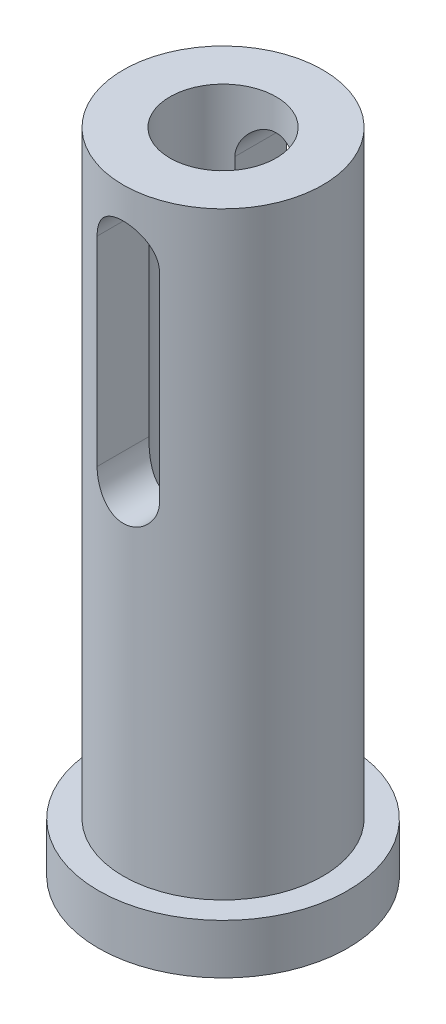
ISO-10303-21;
HEADER;
FILE_DESCRIPTION(('STEP AP214'),'2;1');
FILE_NAME('part.step','',(''),(''),'','','');
FILE_SCHEMA(('AUTOMOTIVE_DESIGN { 1 0 10303 214 1 1 1 1 }'));
ENDSEC;
DATA;
#1=APPLICATION_CONTEXT('core data for automotive mechanical design processes');
#2=APPLICATION_PROTOCOL_DEFINITION('international standard','automotive_design',2000,#1);
#3=PRODUCT_CONTEXT('',#1,'mechanical');
#4=PRODUCT('Part','Part','',(#3));
#5=PRODUCT_RELATED_PRODUCT_CATEGORY('part','',(#4));
#6=PRODUCT_DEFINITION_FORMATION('','',#4);
#7=PRODUCT_DEFINITION_CONTEXT('part definition',#1,'design');
#8=PRODUCT_DEFINITION('design','',#6,#7);
#9=PRODUCT_DEFINITION_SHAPE('','',#8);
#10=(LENGTH_UNIT() NAMED_UNIT(*) SI_UNIT(.MILLI.,.METRE.));
#11=(NAMED_UNIT(*) PLANE_ANGLE_UNIT() SI_UNIT($,.RADIAN.));
#12=(NAMED_UNIT(*) SI_UNIT($,.STERADIAN.) SOLID_ANGLE_UNIT());
#13=UNCERTAINTY_MEASURE_WITH_UNIT(LENGTH_MEASURE(1.E-05),#10,'distance_accuracy_value','');
#14=(GEOMETRIC_REPRESENTATION_CONTEXT(3) GLOBAL_UNCERTAINTY_ASSIGNED_CONTEXT((#13)) GLOBAL_UNIT_ASSIGNED_CONTEXT((#10,
#11,#12)) REPRESENTATION_CONTEXT('',''));
#15=CARTESIAN_POINT('',(0.,0.,0.));
#16=DIRECTION('',(0.,0.,1.));
#17=DIRECTION('',(1.,0.,0.));
#18=AXIS2_PLACEMENT_3D('',#15,#16,#17);
#19=CARTESIAN_POINT('',(0.,1.27,0.));
#20=DIRECTION('',(0.,1.,0.));
#21=DIRECTION('',(0.,0.,1.));
#22=AXIS2_PLACEMENT_3D('',#19,#20,#21);
#23=PLANE('',#22);
#24=CARTESIAN_POINT('',(0.,1.27,0.));
#25=DIRECTION('',(0.,1.,0.));
#26=DIRECTION('',(0.,0.,1.));
#27=AXIS2_PLACEMENT_3D('',#24,#25,#26);
#28=CIRCLE('',#27,3.175);
#29=CARTESIAN_POINT('',(0.,1.27,3.175));
#30=VERTEX_POINT('',#29);
#31=EDGE_CURVE('E111',#30,#30,#28,.T.);
#32=ORIENTED_EDGE('',*,*,#31,.T.);
#33=EDGE_LOOP('',(#32));
#34=FACE_BOUND('',#33,.T.);
#35=CARTESIAN_POINT('',(0.,1.27,0.));
#36=DIRECTION('',(0.,1.,0.));
#37=DIRECTION('',(0.,0.,1.));
#38=AXIS2_PLACEMENT_3D('',#35,#36,#37);
#39=CIRCLE('',#38,2.54);
#40=CARTESIAN_POINT('',(0.,1.27,2.54));
#41=VERTEX_POINT('',#40);
#42=EDGE_CURVE('E238',#41,#41,#39,.T.);
#43=ORIENTED_EDGE('',*,*,#42,.F.);
#44=EDGE_LOOP('',(#43));
#45=FACE_BOUND('',#44,.T.);
#46=ADVANCED_FACE('F34',(#34,#45),#23,.T.);
#47=CARTESIAN_POINT('',(0.,1.27,0.));
#48=DIRECTION('',(0.,-1.,0.));
#49=DIRECTION('',(0.,0.,-1.));
#50=AXIS2_PLACEMENT_3D('',#47,#48,#49);
#51=CYLINDRICAL_SURFACE('',#50,3.175);
#52=ORIENTED_EDGE('',*,*,#31,.F.);
#53=EDGE_LOOP('',(#52));
#54=FACE_BOUND('',#53,.T.);
#55=CARTESIAN_POINT('',(0.,0.,0.));
#56=DIRECTION('',(0.,1.,0.));
#57=DIRECTION('',(0.,0.,1.));
#58=AXIS2_PLACEMENT_3D('',#55,#56,#57);
#59=CIRCLE('',#58,3.175);
#60=CARTESIAN_POINT('',(0.,0.,3.175));
#61=VERTEX_POINT('',#60);
#62=EDGE_CURVE('E244',#61,#61,#59,.T.);
#63=ORIENTED_EDGE('',*,*,#62,.T.);
#64=EDGE_LOOP('',(#63));
#65=FACE_BOUND('',#64,.T.);
#66=ADVANCED_FACE('F36',(#54,#65),#51,.T.);
#67=CARTESIAN_POINT('',(0.,0.,0.));
#68=DIRECTION('',(0.,1.,0.));
#69=DIRECTION('',(0.,0.,1.));
#70=AXIS2_PLACEMENT_3D('',#67,#68,#69);
#71=PLANE('',#70);
#72=CARTESIAN_POINT('',(0.,0.,0.));
#73=DIRECTION('',(0.,1.,0.));
#74=DIRECTION('',(0.,0.,1.));
#75=AXIS2_PLACEMENT_3D('',#72,#73,#74);
#76=CIRCLE('',#75,1.35255);
#77=CARTESIAN_POINT('',(0.,0.,1.35255));
#78=VERTEX_POINT('',#77);
#79=EDGE_CURVE('E234',#78,#78,#76,.T.);
#80=ORIENTED_EDGE('',*,*,#79,.T.);
#81=EDGE_LOOP('',(#80));
#82=FACE_BOUND('',#81,.T.);
#83=ORIENTED_EDGE('',*,*,#62,.F.);
#84=EDGE_LOOP('',(#83));
#85=FACE_BOUND('',#84,.T.);
#86=ADVANCED_FACE('F174',(#82,#85),#71,.F.);
#87=CARTESIAN_POINT('',(0.,16.51,0.));
#88=DIRECTION('',(0.,-1.,0.));
#89=DIRECTION('',(0.,0.,-1.));
#90=AXIS2_PLACEMENT_3D('',#87,#88,#89);
#91=CYLINDRICAL_SURFACE('',#90,2.54);
#92=DIRECTION('',(0.,-1.,0.));
#93=VECTOR('',#92,1.);
#94=CARTESIAN_POINT('',(0.79375,16.51,-2.41279110937934));
#95=LINE('',#94,#93);
#96=CARTESIAN_POINT('',(0.793750000000001,9.8425,-2.41279110937934));
#97=VERTEX_POINT('',#96);
#98=CARTESIAN_POINT('',(0.79375,14.9225,-2.41279110937934));
#99=VERTEX_POINT('',#98);
#100=EDGE_CURVE('E357',#97,#99,#95,.F.);
#101=ORIENTED_EDGE('',*,*,#100,.T.);
#102=CARTESIAN_POINT('',(0.79375,14.9225,-2.41279110937934));
#103=CARTESIAN_POINT('',(0.79379281067982,14.9659894481781,-2.4127435138089));
#104=CARTESIAN_POINT('',(0.790178957825597,15.0094418537647,-2.4139657836181));
#105=CARTESIAN_POINT('',(0.775984671234205,15.0949571729906,-2.418583363011));
#106=CARTESIAN_POINT('',(0.765423455768592,15.1370235845318,-2.42197267724452));
#107=CARTESIAN_POINT('',(0.737683634860841,15.2186870178144,-2.43055955714717));
#108=CARTESIAN_POINT('',(0.720507826274989,15.258285075042,-2.43575635846453));
#109=CARTESIAN_POINT('',(0.680072584019287,15.3340640830475,-2.44735479284788));
#110=CARTESIAN_POINT('',(0.65680998971098,15.3702432451978,-2.45375705137663));
#111=CARTESIAN_POINT('',(0.604010165831729,15.4393761403172,-2.46729294390163));
#112=CARTESIAN_POINT('',(0.574300994184663,15.4721953614169,-2.47444308299022));
#113=CARTESIAN_POINT('',(0.509818467586185,15.5324775419246,-2.48852830450001));
#114=CARTESIAN_POINT('',(0.475044243112647,15.5599395797626,-2.49546334974741));
#115=CARTESIAN_POINT('',(0.400446712633119,15.6093235365452,-2.50852667776335));
#116=CARTESIAN_POINT('',(0.360526985847413,15.6311060802371,-2.51463316208885));
#117=CARTESIAN_POINT('',(0.277368944078276,15.6675943817935,-2.52515738762786));
#118=CARTESIAN_POINT('',(0.234131545708263,15.6823020862052,-2.52957559327973));
#119=CARTESIAN_POINT('',(0.146980305368841,15.7037728590844,-2.53610853228298));
#120=CARTESIAN_POINT('',(0.103128523298337,15.7107671094589,-2.53829014811277));
#121=CARTESIAN_POINT('',(0.0148223218794088,15.7173449675965,-2.54034033646088));
#122=CARTESIAN_POINT('',(-0.0296319707953316,15.7169301096447,-2.54020938786731));
#123=CARTESIAN_POINT('',(-0.116252539808064,15.7088533128654,-2.537695680287));
#124=CARTESIAN_POINT('',(-0.158444817743504,15.7014421087506,-2.53539083193822));
#125=CARTESIAN_POINT('',(-0.24095315878549,15.6799945174717,-2.52888416618637));
#126=CARTESIAN_POINT('',(-0.281269120894142,15.6659577741216,-2.52468224679817));
#127=CARTESIAN_POINT('',(-0.359459801615621,15.6314963490548,-2.51474894280365));
#128=CARTESIAN_POINT('',(-0.397298563877313,15.6109955193591,-2.50899945229794));
#129=CARTESIAN_POINT('',(-0.469076456409295,15.5642490351051,-2.49657687073008));
#130=CARTESIAN_POINT('',(-0.503014638503783,15.538001988208,-2.48990355596477));
#131=CARTESIAN_POINT('',(-0.56752041247911,15.479224141698,-2.47601595657439));
#132=CARTESIAN_POINT('',(-0.597889150885382,15.4464774230458,-2.46879071595744));
#133=CARTESIAN_POINT('',(-0.652769010846034,15.376280426541,-2.45485165178069));
#134=CARTESIAN_POINT('',(-0.677278367331085,15.3388287365414,-2.44813798273964));
#135=CARTESIAN_POINT('',(-0.719978640042612,15.259715815537,-2.43592517868693));
#136=CARTESIAN_POINT('',(-0.738092336656967,15.2180104892784,-2.43044116057281));
#137=CARTESIAN_POINT('',(-0.766955896328744,15.1319509803136,-2.42148936284972));
#138=CARTESIAN_POINT('',(-0.777717137037801,15.0876010062798,-2.41801846926905));
#139=CARTESIAN_POINT('',(-0.7876487394481,15.0227744054238,-2.41479141507531));
#140=CARTESIAN_POINT('',(-0.789936213049729,15.0027814825009,-2.41404312034894));
#141=CARTESIAN_POINT('',(-0.792985601941369,14.9626958195818,-2.41304280699));
#142=CARTESIAN_POINT('',(-0.793749671578141,14.942603260884,-2.41279008753984));
#143=CARTESIAN_POINT('',(-0.79375,14.9225,-2.41279110937934));
#144=B_SPLINE_CURVE_WITH_KNOTS('',3,(#102,#103,#104,#105,#106,#107,#108,#109,#110,#111,#112,
#113,#114,#115,#116,#117,#118,#119,#120,#121,#122,#123,#124,#125,#126,#127,#128,#129,#130,#131,
#132,#133,#134,#135,#136,#137,#138,#139,#140,#141,#142,#143),.UNSPECIFIED.,.F.,.F.,(4,2,2,2,2,2,
2,2,2,2,2,2,2,2,2,2,2,2,2,2,4),(0.,0.130243774400815,0.260128766128355,0.389958898622082,
0.519856581263391,0.653775279966304,0.787716995766958,0.924688599887307,1.06162249652175,
1.19433027896413,1.32701058047151,1.45510946096058,1.58321522877048,1.71289033722623,
1.84259690149036,1.97769726647013,2.11283827769611,2.24955923819043,2.38606814596959,
2.44642615385021,2.50669874474798),.UNSPECIFIED.);
#145=CARTESIAN_POINT('',(-0.79375,14.9225,-2.41279110937934));
#146=VERTEX_POINT('',#145);
#147=EDGE_CURVE('E181',#99,#146,#144,.T.);
#148=ORIENTED_EDGE('',*,*,#147,.T.);
#149=DIRECTION('',(0.,-1.,0.));
#150=VECTOR('',#149,1.);
#151=CARTESIAN_POINT('',(-0.79375,16.51,-2.41279110937934));
#152=LINE('',#151,#150);
#153=CARTESIAN_POINT('',(-0.79375,9.8425,-2.41279110937934));
#154=VERTEX_POINT('',#153);
#155=EDGE_CURVE('E163',#146,#154,#152,.T.);
#156=ORIENTED_EDGE('',*,*,#155,.T.);
#157=CARTESIAN_POINT('',(-0.793749999999999,9.8425,-2.41279110937934));
#158=CARTESIAN_POINT('',(-0.79379281067982,9.79901055182188,-2.4127435138089));
#159=CARTESIAN_POINT('',(-0.790178957825596,9.75555814623533,-2.4139657836181));
#160=CARTESIAN_POINT('',(-0.775984671234205,9.67004282700935,-2.418583363011));
#161=CARTESIAN_POINT('',(-0.765423455768591,9.62797641546816,-2.42197267724452));
#162=CARTESIAN_POINT('',(-0.737683634860841,9.54631298218559,-2.43055955714717));
#163=CARTESIAN_POINT('',(-0.720507826274989,9.50671492495796,-2.43575635846453));
#164=CARTESIAN_POINT('',(-0.680072584019287,9.43093591695246,-2.44735479284788));
#165=CARTESIAN_POINT('',(-0.65680998971098,9.39475675480222,-2.45375705137664));
#166=CARTESIAN_POINT('',(-0.604010165831728,9.32562385968282,-2.46729294390163));
#167=CARTESIAN_POINT('',(-0.574300994184662,9.29280463858305,-2.47444308299022));
#168=CARTESIAN_POINT('',(-0.509818467586184,9.23252245807544,-2.48852830450001));
#169=CARTESIAN_POINT('',(-0.475044243112646,9.20506042023743,-2.49546334974741));
#170=CARTESIAN_POINT('',(-0.400446712633118,9.15567646345479,-2.50852667776335));
#171=CARTESIAN_POINT('',(-0.360526985847413,9.13389391976289,-2.51463316208885));
#172=CARTESIAN_POINT('',(-0.277368944078275,9.09740561820646,-2.52515738762786));
#173=CARTESIAN_POINT('',(-0.234131545708262,9.08269791379479,-2.52957559327973));
#174=CARTESIAN_POINT('',(-0.146980305368838,9.06122714091559,-2.53610853228298));
#175=CARTESIAN_POINT('',(-0.103128523298335,9.05423289054107,-2.53829014811277));
#176=CARTESIAN_POINT('',(-0.0148223218794071,9.0476550324035,-2.54034033646088));
#177=CARTESIAN_POINT('',(0.029631970795333,9.04806989035526,-2.54020938786731));
#178=CARTESIAN_POINT('',(0.116252539808064,9.05614668713456,-2.537695680287));
#179=CARTESIAN_POINT('',(0.158444817743504,9.06355789124939,-2.53539083193822));
#180=CARTESIAN_POINT('',(0.24095315878549,9.08500548252834,-2.52888416618637));
#181=CARTESIAN_POINT('',(0.281269120894142,9.09904222587837,-2.52468224679817));
#182=CARTESIAN_POINT('',(0.359459801615622,9.13350365094521,-2.51474894280365));
#183=CARTESIAN_POINT('',(0.397298563877313,9.15400448064085,-2.50899945229794));
#184=CARTESIAN_POINT('',(0.469076456409295,9.20075096489485,-2.49657687073008));
#185=CARTESIAN_POINT('',(0.503014638503783,9.22699801179198,-2.48990355596477));
#186=CARTESIAN_POINT('',(0.567520412479111,9.28577585830201,-2.47601595657439));
#187=CARTESIAN_POINT('',(0.597889150885384,9.31852257695419,-2.46879071595744));
#188=CARTESIAN_POINT('',(0.652769010846035,9.38871957345898,-2.45485165178069));
#189=CARTESIAN_POINT('',(0.677278367331086,9.42617126345857,-2.44813798273964));
#190=CARTESIAN_POINT('',(0.719978640042612,9.50528418446297,-2.43592517868693));
#191=CARTESIAN_POINT('',(0.738092336656968,9.5469895107216,-2.43044116057281));
#192=CARTESIAN_POINT('',(0.766955896328744,9.63304901968641,-2.42148936284972));
#193=CARTESIAN_POINT('',(0.777717137037801,9.67739899372024,-2.41801846926905));
#194=CARTESIAN_POINT('',(0.7876487394481,9.74222559457624,-2.41479141507531));
#195=CARTESIAN_POINT('',(0.78993621304973,9.76221851749911,-2.41404312034894));
#196=CARTESIAN_POINT('',(0.792985601941369,9.80230418041821,-2.41304280699));
#197=CARTESIAN_POINT('',(0.793749671578142,9.822396739116,-2.41279008753984));
#198=CARTESIAN_POINT('',(0.793750000000001,9.8425,-2.41279110937934));
#199=B_SPLINE_CURVE_WITH_KNOTS('',3,(#157,#158,#159,#160,#161,#162,#163,#164,#165,#166,#167,
#168,#169,#170,#171,#172,#173,#174,#175,#176,#177,#178,#179,#180,#181,#182,#183,#184,#185,#186,
#187,#188,#189,#190,#191,#192,#193,#194,#195,#196,#197,#198),.UNSPECIFIED.,.F.,.F.,(4,2,2,2,2,2,
2,2,2,2,2,2,2,2,2,2,2,2,2,2,4),(0.,0.130243774400815,0.260128766128355,0.389958898622082,
0.519856581263391,0.653775279966304,0.787716995766958,0.924688599887306,1.06162249652175,
1.19433027896413,1.32701058047151,1.45510946096058,1.58321522877047,1.71289033722623,
1.84259690149036,1.97769726647013,2.11283827769611,2.24955923819043,2.38606814596959,
2.44642615385021,2.50669874474798),.UNSPECIFIED.);
#200=EDGE_CURVE('E118',#154,#97,#199,.T.);
#201=ORIENTED_EDGE('',*,*,#200,.T.);
#202=EDGE_LOOP('',(#101,#148,#156,#201));
#203=FACE_BOUND('',#202,.T.);
#204=DIRECTION('',(0.,-1.,0.));
#205=VECTOR('',#204,1.);
#206=CARTESIAN_POINT('',(-0.79375,16.51,2.41279110937934));
#207=LINE('',#206,#205);
#208=CARTESIAN_POINT('',(-0.793749999999999,9.8425,2.41279110937934));
#209=VERTEX_POINT('',#208);
#210=CARTESIAN_POINT('',(-0.79375,14.9225,2.41279110937934));
#211=VERTEX_POINT('',#210);
#212=EDGE_CURVE('E223',#209,#211,#207,.F.);
#213=ORIENTED_EDGE('',*,*,#212,.T.);
#214=CARTESIAN_POINT('',(-0.79375,14.9225,2.41279110937934));
#215=CARTESIAN_POINT('',(-0.79379281067982,14.9659894481781,2.4127435138089));
#216=CARTESIAN_POINT('',(-0.790178957825597,15.0094418537647,2.4139657836181));
#217=CARTESIAN_POINT('',(-0.775984671234206,15.0949571729906,2.418583363011));
#218=CARTESIAN_POINT('',(-0.765423455768592,15.1370235845318,2.42197267724452));
#219=CARTESIAN_POINT('',(-0.737683634860841,15.2186870178144,2.43055955714717));
#220=CARTESIAN_POINT('',(-0.72050782627499,15.258285075042,2.43575635846453));
#221=CARTESIAN_POINT('',(-0.680072584019287,15.3340640830475,2.44735479284788));
#222=CARTESIAN_POINT('',(-0.65680998971098,15.3702432451978,2.45375705137663));
#223=CARTESIAN_POINT('',(-0.604010165831729,15.4393761403172,2.46729294390163));
#224=CARTESIAN_POINT('',(-0.574300994184663,15.4721953614169,2.47444308299022));
#225=CARTESIAN_POINT('',(-0.509818467586185,15.5324775419246,2.48852830450001));
#226=CARTESIAN_POINT('',(-0.475044243112647,15.5599395797626,2.49546334974741));
#227=CARTESIAN_POINT('',(-0.400446712633119,15.6093235365452,2.50852667776335));
#228=CARTESIAN_POINT('',(-0.360526985847414,15.6311060802371,2.51463316208885));
#229=CARTESIAN_POINT('',(-0.277368944078276,15.6675943817935,2.52515738762786));
#230=CARTESIAN_POINT('',(-0.234131545708264,15.6823020862052,2.52957559327973));
#231=CARTESIAN_POINT('',(-0.146980305368841,15.7037728590844,2.53610853228298));
#232=CARTESIAN_POINT('',(-0.103128523298337,15.7107671094589,2.53829014811277));
#233=CARTESIAN_POINT('',(-0.0148223218794088,15.7173449675965,2.54034033646088));
#234=CARTESIAN_POINT('',(0.0296319707953316,15.7169301096447,2.54020938786731));
#235=CARTESIAN_POINT('',(0.116252539808063,15.7088533128654,2.537695680287));
#236=CARTESIAN_POINT('',(0.158444817743503,15.7014421087506,2.53539083193822));
#237=CARTESIAN_POINT('',(0.24095315878549,15.6799945174717,2.52888416618637));
#238=CARTESIAN_POINT('',(0.281269120894141,15.6659577741216,2.52468224679817));
#239=CARTESIAN_POINT('',(0.359459801615621,15.6314963490548,2.51474894280365));
#240=CARTESIAN_POINT('',(0.397298563877312,15.6109955193591,2.50899945229794));
#241=CARTESIAN_POINT('',(0.469076456409295,15.5642490351051,2.49657687073008));
#242=CARTESIAN_POINT('',(0.503014638503783,15.538001988208,2.48990355596477));
#243=CARTESIAN_POINT('',(0.56752041247911,15.479224141698,2.47601595657439));
#244=CARTESIAN_POINT('',(0.597889150885382,15.4464774230458,2.46879071595744));
#245=CARTESIAN_POINT('',(0.652769010846034,15.376280426541,2.45485165178069));
#246=CARTESIAN_POINT('',(0.677278367331085,15.3388287365414,2.44813798273964));
#247=CARTESIAN_POINT('',(0.719978640042611,15.259715815537,2.43592517868693));
#248=CARTESIAN_POINT('',(0.738092336656967,15.2180104892784,2.43044116057281));
#249=CARTESIAN_POINT('',(0.766955896328743,15.1319509803136,2.42148936284972));
#250=CARTESIAN_POINT('',(0.7777171370378,15.0876010062798,2.41801846926905));
#251=CARTESIAN_POINT('',(0.787648739448099,15.0227744054238,2.41479141507531));
#252=CARTESIAN_POINT('',(0.789936213049729,15.0027814825009,2.41404312034894));
#253=CARTESIAN_POINT('',(0.792985601941369,14.9626958195818,2.41304280699));
#254=CARTESIAN_POINT('',(0.793749671578141,14.942603260884,2.41279008753984));
#255=CARTESIAN_POINT('',(0.79375,14.9225,2.41279110937934));
#256=B_SPLINE_CURVE_WITH_KNOTS('',3,(#214,#215,#216,#217,#218,#219,#220,#221,#222,#223,#224,
#225,#226,#227,#228,#229,#230,#231,#232,#233,#234,#235,#236,#237,#238,#239,#240,#241,#242,#243,
#244,#245,#246,#247,#248,#249,#250,#251,#252,#253,#254,#255),.UNSPECIFIED.,.F.,.F.,(4,2,2,2,2,2,
2,2,2,2,2,2,2,2,2,2,2,2,2,2,4),(0.,0.130243774400815,0.260128766128355,0.389958898622082,
0.519856581263391,0.653775279966304,0.787716995766958,0.924688599887307,1.06162249652175,
1.19433027896413,1.32701058047151,1.45510946096058,1.58321522877048,1.71289033722623,
1.84259690149036,1.97769726647013,2.11283827769611,2.24955923819042,2.38606814596959,
2.44642615385021,2.50669874474798),.UNSPECIFIED.);
#257=CARTESIAN_POINT('',(0.79375,14.9225,2.41279110937934));
#258=VERTEX_POINT('',#257);
#259=EDGE_CURVE('E187',#211,#258,#256,.T.);
#260=ORIENTED_EDGE('',*,*,#259,.T.);
#261=DIRECTION('',(0.,-1.,0.));
#262=VECTOR('',#261,1.);
#263=CARTESIAN_POINT('',(0.79375,16.51,2.41279110937934));
#264=LINE('',#263,#262);
#265=CARTESIAN_POINT('',(0.793750000000001,9.8425,2.41279110937934));
#266=VERTEX_POINT('',#265);
#267=EDGE_CURVE('E188',#258,#266,#264,.T.);
#268=ORIENTED_EDGE('',*,*,#267,.T.);
#269=CARTESIAN_POINT('',(0.793750000000001,9.8425,2.41279110937934));
#270=CARTESIAN_POINT('',(0.793792810679821,9.79901055182188,2.4127435138089));
#271=CARTESIAN_POINT('',(0.790178957825597,9.75555814623533,2.4139657836181));
#272=CARTESIAN_POINT('',(0.775984671234206,9.67004282700935,2.418583363011));
#273=CARTESIAN_POINT('',(0.765423455768592,9.62797641546816,2.42197267724452));
#274=CARTESIAN_POINT('',(0.737683634860841,9.54631298218558,2.43055955714717));
#275=CARTESIAN_POINT('',(0.720507826274989,9.50671492495796,2.43575635846453));
#276=CARTESIAN_POINT('',(0.680072584019287,9.43093591695246,2.44735479284788));
#277=CARTESIAN_POINT('',(0.656809989710979,9.39475675480222,2.45375705137664));
#278=CARTESIAN_POINT('',(0.604010165831728,9.32562385968282,2.46729294390163));
#279=CARTESIAN_POINT('',(0.574300994184661,9.29280463858305,2.47444308299022));
#280=CARTESIAN_POINT('',(0.509818467586182,9.23252245807544,2.48852830450001));
#281=CARTESIAN_POINT('',(0.475044243112645,9.20506042023743,2.49546334974741));
#282=CARTESIAN_POINT('',(0.400446712633117,9.15567646345479,2.50852667776335));
#283=CARTESIAN_POINT('',(0.360526985847413,9.13389391976289,2.51463316208885));
#284=CARTESIAN_POINT('',(0.277368944078275,9.09740561820645,2.52515738762786));
#285=CARTESIAN_POINT('',(0.234131545708262,9.08269791379479,2.52957559327973));
#286=CARTESIAN_POINT('',(0.146980305368838,9.06122714091559,2.53610853228298));
#287=CARTESIAN_POINT('',(0.103128523298335,9.05423289054107,2.53829014811277));
#288=CARTESIAN_POINT('',(0.0148223218794073,9.0476550324035,2.54034033646088));
#289=CARTESIAN_POINT('',(-0.0296319707953331,9.04806989035526,2.54020938786731));
#290=CARTESIAN_POINT('',(-0.116252539808065,9.05614668713456,2.537695680287));
#291=CARTESIAN_POINT('',(-0.158444817743504,9.06355789124939,2.53539083193822));
#292=CARTESIAN_POINT('',(-0.240953158785491,9.08500548252834,2.52888416618637));
#293=CARTESIAN_POINT('',(-0.281269120894142,9.09904222587837,2.52468224679817));
#294=CARTESIAN_POINT('',(-0.359459801615622,9.13350365094521,2.51474894280365));
#295=CARTESIAN_POINT('',(-0.397298563877314,9.15400448064085,2.50899945229794));
#296=CARTESIAN_POINT('',(-0.469076456409296,9.20075096489485,2.49657687073008));
#297=CARTESIAN_POINT('',(-0.503014638503784,9.22699801179198,2.48990355596477));
#298=CARTESIAN_POINT('',(-0.567520412479111,9.28577585830201,2.47601595657439));
#299=CARTESIAN_POINT('',(-0.597889150885384,9.31852257695419,2.46879071595744));
#300=CARTESIAN_POINT('',(-0.652769010846036,9.38871957345898,2.45485165178069));
#301=CARTESIAN_POINT('',(-0.677278367331086,9.42617126345857,2.44813798273964));
#302=CARTESIAN_POINT('',(-0.719978640042612,9.50528418446298,2.43592517868693));
#303=CARTESIAN_POINT('',(-0.738092336656967,9.5469895107216,2.43044116057281));
#304=CARTESIAN_POINT('',(-0.766955896328743,9.63304901968641,2.42148936284972));
#305=CARTESIAN_POINT('',(-0.7777171370378,9.67739899372024,2.41801846926905));
#306=CARTESIAN_POINT('',(-0.787648739448099,9.74222559457624,2.41479141507531));
#307=CARTESIAN_POINT('',(-0.789936213049729,9.76221851749911,2.41404312034894));
#308=CARTESIAN_POINT('',(-0.792985601941368,9.80230418041821,2.41304280699));
#309=CARTESIAN_POINT('',(-0.79374967157814,9.822396739116,2.41279008753984));
#310=CARTESIAN_POINT('',(-0.793749999999999,9.8425,2.41279110937934));
#311=B_SPLINE_CURVE_WITH_KNOTS('',3,(#269,#270,#271,#272,#273,#274,#275,#276,#277,#278,#279,
#280,#281,#282,#283,#284,#285,#286,#287,#288,#289,#290,#291,#292,#293,#294,#295,#296,#297,#298,
#299,#300,#301,#302,#303,#304,#305,#306,#307,#308,#309,#310),.UNSPECIFIED.,.F.,.F.,(4,2,2,2,2,2,
2,2,2,2,2,2,2,2,2,2,2,2,2,2,4),(0.,0.130243774400815,0.260128766128356,0.389958898622084,
0.519856581263393,0.653775279966309,0.787716995766961,0.924688599887309,1.06162249652175,
1.19433027896413,1.32701058047151,1.45510946096058,1.58321522877048,1.71289033722623,
1.84259690149036,1.97769726647013,2.11283827769611,2.24955923819043,2.38606814596959,
2.44642615385021,2.50669874474798),.UNSPECIFIED.);
#312=EDGE_CURVE('E162',#266,#209,#311,.T.);
#313=ORIENTED_EDGE('',*,*,#312,.T.);
#314=EDGE_LOOP('',(#213,#260,#268,#313));
#315=FACE_BOUND('',#314,.T.);
#316=CARTESIAN_POINT('',(0.,16.51,0.));
#317=DIRECTION('',(0.,1.,0.));
#318=DIRECTION('',(0.,0.,1.));
#319=AXIS2_PLACEMENT_3D('',#316,#317,#318);
#320=CIRCLE('',#319,2.54);
#321=CARTESIAN_POINT('',(0.,16.51,2.54));
#322=VERTEX_POINT('',#321);
#323=EDGE_CURVE('E241',#322,#322,#320,.T.);
#324=ORIENTED_EDGE('',*,*,#323,.F.);
#325=EDGE_LOOP('',(#324));
#326=FACE_BOUND('',#325,.T.);
#327=ORIENTED_EDGE('',*,*,#42,.T.);
#328=EDGE_LOOP('',(#327));
#329=FACE_BOUND('',#328,.T.);
#330=ADVANCED_FACE('F169',(#203,#315,#326,#329),#91,.T.);
#331=CARTESIAN_POINT('',(0.,16.51,0.));
#332=DIRECTION('',(0.,1.,0.));
#333=DIRECTION('',(0.,0.,1.));
#334=AXIS2_PLACEMENT_3D('',#331,#332,#333);
#335=PLANE('',#334);
#336=CARTESIAN_POINT('',(0.,16.51,0.));
#337=DIRECTION('',(0.,1.,0.));
#338=DIRECTION('',(0.,0.,1.));
#339=AXIS2_PLACEMENT_3D('',#336,#337,#338);
#340=CIRCLE('',#339,1.35255);
#341=CARTESIAN_POINT('',(0.,16.51,1.35255));
#342=VERTEX_POINT('',#341);
#343=EDGE_CURVE('E232',#342,#342,#340,.T.);
#344=ORIENTED_EDGE('',*,*,#343,.F.);
#345=EDGE_LOOP('',(#344));
#346=FACE_BOUND('',#345,.T.);
#347=ORIENTED_EDGE('',*,*,#323,.T.);
#348=EDGE_LOOP('',(#347));
#349=FACE_BOUND('',#348,.T.);
#350=ADVANCED_FACE('F173',(#346,#349),#335,.T.);
#351=CARTESIAN_POINT('',(0.,16.51,0.));
#352=DIRECTION('',(0.,1.,0.));
#353=DIRECTION('',(0.,0.,1.));
#354=AXIS2_PLACEMENT_3D('',#351,#352,#353);
#355=CYLINDRICAL_SURFACE('',#354,1.35255);
#356=DIRECTION('',(0.,1.,0.));
#357=VECTOR('',#356,1.);
#358=CARTESIAN_POINT('',(0.79375,16.51,1.09514950577535));
#359=LINE('',#358,#357);
#360=CARTESIAN_POINT('',(0.793750000000001,9.8425,1.09514950577535));
#361=VERTEX_POINT('',#360);
#362=CARTESIAN_POINT('',(0.79375,14.9225,1.09514950577535));
#363=VERTEX_POINT('',#362);
#364=EDGE_CURVE('E47',#361,#363,#359,.T.);
#365=ORIENTED_EDGE('',*,*,#364,.T.);
#366=CARTESIAN_POINT('',(0.79375,14.9225,1.09514950577535));
#367=CARTESIAN_POINT('',(0.793752242841836,14.9426822192542,1.09514371187939));
#368=CARTESIAN_POINT('',(0.792979771955055,14.9628517909962,1.09570806897586));
#369=CARTESIAN_POINT('',(0.78991373073973,15.0029969177056,1.09792229486793));
#370=CARTESIAN_POINT('',(0.787621555336789,15.0229726335669,1.09957116818304));
#371=CARTESIAN_POINT('',(0.778557452345913,15.0820747331764,1.10602730942596));
#372=CARTESIAN_POINT('',(0.769596831644951,15.1207243573743,1.11234599296665));
#373=CARTESIAN_POINT('',(0.746348777011716,15.1955135263218,1.12807248320908));
#374=CARTESIAN_POINT('',(0.732078762135602,15.2316608257383,1.13747017638918));
#375=CARTESIAN_POINT('',(0.698703310698202,15.3011028819931,1.15827124418267));
#376=CARTESIAN_POINT('',(0.679587396042351,15.334391245543,1.16967894845131));
#377=CARTESIAN_POINT('',(0.634498936295003,15.4013123562845,1.19479790754642));
#378=CARTESIAN_POINT('',(0.60798931541846,15.4345403648626,1.208623020942));
#379=CARTESIAN_POINT('',(0.549976298881777,15.4964024911184,1.23610224924636));
#380=CARTESIAN_POINT('',(0.518471174561749,15.5250350116319,1.24975630318985));
#381=CARTESIAN_POINT('',(0.447455010037481,15.5797909436776,1.27701353472154));
#382=CARTESIAN_POINT('',(0.40745521437641,15.6053608960495,1.29046958933532));
#383=CARTESIAN_POINT('',(0.322779944211664,15.6492180738249,1.31420364037885));
#384=CARTESIAN_POINT('',(0.278108385827029,15.6675113381088,1.32448427048414));
#385=CARTESIAN_POINT('',(0.189713682339535,15.6944984691126,1.33985941148723));
#386=CARTESIAN_POINT('',(0.146283034586993,15.7039220589422,1.34534477671677));
#387=CARTESIAN_POINT('',(0.0581447804675731,15.7153604844603,1.35201973131189));
#388=CARTESIAN_POINT('',(0.0134383361069931,15.71738185795,1.35321311143702));
#389=CARTESIAN_POINT('',(-0.07026011226229,15.7141094266998,1.35129495430079));
#390=CARTESIAN_POINT('',(-0.109300138126607,15.7096559860758,1.34867790996385));
#391=CARTESIAN_POINT('',(-0.185962163016299,15.6951441368733,1.34025983263557));
#392=CARTESIAN_POINT('',(-0.223584066923818,15.6850853530387,1.33445858647455));
#393=CARTESIAN_POINT('',(-0.296758348027282,15.6597146742435,1.32012422099449));
#394=CARTESIAN_POINT('',(-0.332293579414153,15.6443649025071,1.31157143440237));
#395=CARTESIAN_POINT('',(-0.40033442420121,15.6089718679719,1.29242975985178));
#396=CARTESIAN_POINT('',(-0.432839252174698,15.5889273930915,1.28184034620201));
#397=CARTESIAN_POINT('',(-0.497953952854304,15.5420740974208,1.25808179132174));
#398=CARTESIAN_POINT('',(-0.53013507790544,15.5147493289592,1.24475583668681));
#399=CARTESIAN_POINT('',(-0.589732586183639,15.4554407317887,1.21765404612299));
#400=CARTESIAN_POINT('',(-0.617141673466846,15.4234499040287,1.20387755891548));
#401=CARTESIAN_POINT('',(-0.669415619797064,15.351575752017,1.17569081449142));
#402=CARTESIAN_POINT('',(-0.693677152740052,15.3112121901522,1.16137525433097));
#403=CARTESIAN_POINT('',(-0.734890819169935,15.2261387724901,1.13574458443753));
#404=CARTESIAN_POINT('',(-0.751867162019529,15.1814439266243,1.12441958582323));
#405=CARTESIAN_POINT('',(-0.774218475847313,15.1010294527994,1.10910667907366));
#406=CARTESIAN_POINT('',(-0.781472249100803,15.0660511254045,1.10397148608644));
#407=CARTESIAN_POINT('',(-0.791269127587977,14.9949142346218,1.09694883902076));
#408=CARTESIAN_POINT('',(-0.793783295345863,14.9587497839448,1.09508134066146));
#409=CARTESIAN_POINT('',(-0.79375,14.9225,1.09514950577535));
#410=B_SPLINE_CURVE_WITH_KNOTS('',3,(#366,#367,#368,#369,#370,#371,#372,#373,#374,#375,#376,
#377,#378,#379,#380,#381,#382,#383,#384,#385,#386,#387,#388,#389,#390,#391,#392,#393,#394,#395,
#396,#397,#398,#399,#400,#401,#402,#403,#404,#405,#406,#407,#408,#409),.UNSPECIFIED.,.F.,.F.,(4,
2,2,2,2,2,2,2,2,2,2,2,2,2,2,2,2,2,2,2,2,4),(0.,0.0605004074531774,0.120945358768268,
0.240806350146542,0.360277520272994,0.480009254992086,0.613577172663846,0.747191411880413,
0.894428498927407,1.04154313857325,1.17508986765504,1.30851861682349,1.42609896906142,
1.5436871937972,1.6621353116853,1.78061404436664,1.91289272086357,2.04537189469354,
2.19229686254541,2.33872973146987,2.44654735813885,2.55502115557867),.UNSPECIFIED.);
#411=CARTESIAN_POINT('',(-0.79375,14.9225,1.09514950577535));
#412=VERTEX_POINT('',#411);
#413=EDGE_CURVE('E11',#363,#412,#410,.T.);
#414=ORIENTED_EDGE('',*,*,#413,.T.);
#415=DIRECTION('',(0.,1.,0.));
#416=VECTOR('',#415,1.);
#417=CARTESIAN_POINT('',(-0.79375,16.51,1.09514950577535));
#418=LINE('',#417,#416);
#419=CARTESIAN_POINT('',(-0.79375,9.8425,1.09514950577535));
#420=VERTEX_POINT('',#419);
#421=EDGE_CURVE('E204',#412,#420,#418,.F.);
#422=ORIENTED_EDGE('',*,*,#421,.T.);
#423=CARTESIAN_POINT('',(-0.793749999999999,9.8425,1.09514950577535));
#424=CARTESIAN_POINT('',(-0.793752242841836,9.82231778074581,1.09514371187939));
#425=CARTESIAN_POINT('',(-0.792979771955054,9.80214820900379,1.09570806897586));
#426=CARTESIAN_POINT('',(-0.78991373073973,9.76200308229442,1.09792229486793));
#427=CARTESIAN_POINT('',(-0.787621555336788,9.74202736643307,1.09957116818304));
#428=CARTESIAN_POINT('',(-0.778557452345912,9.68292526682357,1.10602730942596));
#429=CARTESIAN_POINT('',(-0.769596831644951,9.64427564262573,1.11234599296665));
#430=CARTESIAN_POINT('',(-0.746348777011715,9.56948647367815,1.12807248320908));
#431=CARTESIAN_POINT('',(-0.732078762135601,9.53333917426165,1.13747017638918));
#432=CARTESIAN_POINT('',(-0.6987033106982,9.46389711800694,1.15827124418267));
#433=CARTESIAN_POINT('',(-0.67958739604235,9.43060875445702,1.16967894845131));
#434=CARTESIAN_POINT('',(-0.634498936295003,9.36368764371548,1.19479790754642));
#435=CARTESIAN_POINT('',(-0.60798931541846,9.33045963513741,1.208623020942));
#436=CARTESIAN_POINT('',(-0.549976298881777,9.26859750888158,1.23610224924636));
#437=CARTESIAN_POINT('',(-0.518471174561748,9.23996498836813,1.24975630318985));
#438=CARTESIAN_POINT('',(-0.44745501003748,9.18520905632241,1.27701353472155));
#439=CARTESIAN_POINT('',(-0.407455214376409,9.15963910395052,1.29046958933532));
#440=CARTESIAN_POINT('',(-0.322779944211663,9.11578192617513,1.31420364037885));
#441=CARTESIAN_POINT('',(-0.278108385827029,9.09748866189118,1.32448427048414));
#442=CARTESIAN_POINT('',(-0.189713682339535,9.07050153088741,1.33985941148723));
#443=CARTESIAN_POINT('',(-0.146283034586993,9.06107794105778,1.34534477671677));
#444=CARTESIAN_POINT('',(-0.0581447804675723,9.04963951553971,1.35201973131189));
#445=CARTESIAN_POINT('',(-0.0134383361069922,9.04761814205003,1.35321311143702));
#446=CARTESIAN_POINT('',(0.070260112262291,9.05089057330016,1.35129495430078));
#447=CARTESIAN_POINT('',(0.109300138126608,9.05534401392418,1.34867790996385));
#448=CARTESIAN_POINT('',(0.1859621630163,9.06985586312665,1.34025983263557));
#449=CARTESIAN_POINT('',(0.223584066923818,9.07991464696125,1.33445858647455));
#450=CARTESIAN_POINT('',(0.296758348027283,9.10528532575653,1.32012422099449));
#451=CARTESIAN_POINT('',(0.332293579414154,9.12063509749293,1.31157143440237));
#452=CARTESIAN_POINT('',(0.400334424201211,9.15602813202806,1.29242975985178));
#453=CARTESIAN_POINT('',(0.432839252174699,9.17607260690851,1.28184034620201));
#454=CARTESIAN_POINT('',(0.497953952854306,9.22292590257916,1.25808179132174));
#455=CARTESIAN_POINT('',(0.530135077905443,9.25025067104082,1.24475583668681));
#456=CARTESIAN_POINT('',(0.589732586183641,9.30955926821131,1.21765404612299));
#457=CARTESIAN_POINT('',(0.617141673466847,9.34155009597128,1.20387755891548));
#458=CARTESIAN_POINT('',(0.669415619797064,9.41342424798299,1.17569081449142));
#459=CARTESIAN_POINT('',(0.693677152740053,9.45378780984777,1.16137525433097));
#460=CARTESIAN_POINT('',(0.734890819169936,9.53886122750985,1.13574458443753));
#461=CARTESIAN_POINT('',(0.75186716201953,9.58355607337566,1.12441958582323));
#462=CARTESIAN_POINT('',(0.774218475847314,9.66397054720064,1.10910667907366));
#463=CARTESIAN_POINT('',(0.781472249100803,9.69894887459546,1.10397148608644));
#464=CARTESIAN_POINT('',(0.791269127587978,9.77008576537823,1.09694883902076));
#465=CARTESIAN_POINT('',(0.793783295345863,9.80625021605519,1.09508134066146));
#466=CARTESIAN_POINT('',(0.793750000000001,9.8425,1.09514950577535));
#467=B_SPLINE_CURVE_WITH_KNOTS('',3,(#423,#424,#425,#426,#427,#428,#429,#430,#431,#432,#433,
#434,#435,#436,#437,#438,#439,#440,#441,#442,#443,#444,#445,#446,#447,#448,#449,#450,#451,#452,
#453,#454,#455,#456,#457,#458,#459,#460,#461,#462,#463,#464,#465,#466),.UNSPECIFIED.,.F.,.F.,(4,
2,2,2,2,2,2,2,2,2,2,2,2,2,2,2,2,2,2,2,2,4),(0.,0.0605004074531792,0.120945358768268,
0.240806350146542,0.360277520272996,0.480009254992086,0.613577172663845,0.747191411880413,
0.894428498927407,1.04154313857325,1.17508986765504,1.30851861682349,1.42609896906142,
1.5436871937972,1.6621353116853,1.78061404436664,1.91289272086357,2.04537189469354,
2.19229686254541,2.33872973146987,2.44654735813885,2.55502115557867),.UNSPECIFIED.);
#468=EDGE_CURVE('E151',#420,#361,#467,.T.);
#469=ORIENTED_EDGE('',*,*,#468,.T.);
#470=EDGE_LOOP('',(#365,#414,#422,#469));
#471=FACE_BOUND('',#470,.T.);
#472=DIRECTION('',(0.,1.,0.));
#473=VECTOR('',#472,1.);
#474=CARTESIAN_POINT('',(-0.79375,16.51,-1.09514950577535));
#475=LINE('',#474,#473);
#476=CARTESIAN_POINT('',(-0.793749999999999,9.8425,-1.09514950577535));
#477=VERTEX_POINT('',#476);
#478=CARTESIAN_POINT('',(-0.79375,14.9225,-1.09514950577535));
#479=VERTEX_POINT('',#478);
#480=EDGE_CURVE('E102',#477,#479,#475,.T.);
#481=ORIENTED_EDGE('',*,*,#480,.T.);
#482=CARTESIAN_POINT('',(-0.79375,14.9225,-1.09514950577535));
#483=CARTESIAN_POINT('',(-0.793752242841836,14.9426822192542,-1.09514371187939));
#484=CARTESIAN_POINT('',(-0.792979771955055,14.9628517909962,-1.09570806897586));
#485=CARTESIAN_POINT('',(-0.78991373073973,15.0029969177056,-1.09792229486793));
#486=CARTESIAN_POINT('',(-0.787621555336789,15.0229726335669,-1.09957116818304));
#487=CARTESIAN_POINT('',(-0.778557452345913,15.0820747331764,-1.10602730942596));
#488=CARTESIAN_POINT('',(-0.769596831644951,15.1207243573743,-1.11234599296665));
#489=CARTESIAN_POINT('',(-0.746348777011716,15.1955135263218,-1.12807248320908));
#490=CARTESIAN_POINT('',(-0.732078762135602,15.2316608257383,-1.13747017638918));
#491=CARTESIAN_POINT('',(-0.698703310698201,15.3011028819931,-1.15827124418267));
#492=CARTESIAN_POINT('',(-0.679587396042351,15.334391245543,-1.16967894845131));
#493=CARTESIAN_POINT('',(-0.634498936295004,15.4013123562845,-1.19479790754642));
#494=CARTESIAN_POINT('',(-0.607989315418461,15.4345403648626,-1.208623020942));
#495=CARTESIAN_POINT('',(-0.549976298881779,15.4964024911184,-1.23610224924635));
#496=CARTESIAN_POINT('',(-0.518471174561749,15.5250350116319,-1.24975630318985));
#497=CARTESIAN_POINT('',(-0.447455010037481,15.5797909436776,-1.27701353472154));
#498=CARTESIAN_POINT('',(-0.40745521437641,15.6053608960495,-1.29046958933532));
#499=CARTESIAN_POINT('',(-0.322779944211664,15.6492180738249,-1.31420364037885));
#500=CARTESIAN_POINT('',(-0.278108385827029,15.6675113381088,-1.32448427048414));
#501=CARTESIAN_POINT('',(-0.189713682339535,15.6944984691126,-1.33985941148723));
#502=CARTESIAN_POINT('',(-0.146283034586994,15.7039220589422,-1.34534477671677));
#503=CARTESIAN_POINT('',(-0.0581447804675733,15.7153604844603,-1.35201973131189));
#504=CARTESIAN_POINT('',(-0.0134383361069933,15.71738185795,-1.35321311143702));
#505=CARTESIAN_POINT('',(0.0702601122622898,15.7141094266998,-1.35129495430079));
#506=CARTESIAN_POINT('',(0.109300138126607,15.7096559860758,-1.34867790996385));
#507=CARTESIAN_POINT('',(0.185962163016299,15.6951441368733,-1.34025983263557));
#508=CARTESIAN_POINT('',(0.223584066923817,15.6850853530387,-1.33445858647455));
#509=CARTESIAN_POINT('',(0.296758348027282,15.6597146742435,-1.32012422099449));
#510=CARTESIAN_POINT('',(0.332293579414153,15.6443649025071,-1.31157143440237));
#511=CARTESIAN_POINT('',(0.40033442420121,15.6089718679719,-1.29242975985178));
#512=CARTESIAN_POINT('',(0.432839252174698,15.5889273930915,-1.28184034620201));
#513=CARTESIAN_POINT('',(0.497953952854304,15.5420740974208,-1.25808179132174));
#514=CARTESIAN_POINT('',(0.53013507790544,15.5147493289592,-1.24475583668681));
#515=CARTESIAN_POINT('',(0.589732586183639,15.4554407317887,-1.21765404612299));
#516=CARTESIAN_POINT('',(0.617141673466846,15.4234499040287,-1.20387755891548));
#517=CARTESIAN_POINT('',(0.669415619797064,15.351575752017,-1.17569081449142));
#518=CARTESIAN_POINT('',(0.693677152740052,15.3112121901522,-1.16137525433097));
#519=CARTESIAN_POINT('',(0.734890819169935,15.2261387724901,-1.13574458443753));
#520=CARTESIAN_POINT('',(0.751867162019529,15.1814439266243,-1.12441958582323));
#521=CARTESIAN_POINT('',(0.774218475847313,15.1010294527994,-1.10910667907366));
#522=CARTESIAN_POINT('',(0.781472249100803,15.0660511254045,-1.10397148608644));
#523=CARTESIAN_POINT('',(0.791269127587977,14.9949142346218,-1.09694883902076));
#524=CARTESIAN_POINT('',(0.793783295345863,14.9587497839448,-1.09508134066146));
#525=CARTESIAN_POINT('',(0.79375,14.9225,-1.09514950577535));
#526=B_SPLINE_CURVE_WITH_KNOTS('',3,(#482,#483,#484,#485,#486,#487,#488,#489,#490,#491,#492,
#493,#494,#495,#496,#497,#498,#499,#500,#501,#502,#503,#504,#505,#506,#507,#508,#509,#510,#511,
#512,#513,#514,#515,#516,#517,#518,#519,#520,#521,#522,#523,#524,#525),.UNSPECIFIED.,.F.,.F.,(4,
2,2,2,2,2,2,2,2,2,2,2,2,2,2,2,2,2,2,2,2,4),(0.,0.0605004074531774,0.120945358768268,
0.240806350146542,0.360277520272996,0.480009254992086,0.613577172663843,0.747191411880413,
0.894428498927407,1.04154313857325,1.17508986765504,1.30851861682349,1.42609896906142,
1.5436871937972,1.6621353116853,1.78061404436664,1.91289272086357,2.04537189469354,
2.19229686254541,2.33872973146987,2.44654735813885,2.55502115557867),.UNSPECIFIED.);
#527=CARTESIAN_POINT('',(0.79375,14.9225,-1.09514950577535));
#528=VERTEX_POINT('',#527);
#529=EDGE_CURVE('E128',#479,#528,#526,.T.);
#530=ORIENTED_EDGE('',*,*,#529,.T.);
#531=DIRECTION('',(0.,1.,0.));
#532=VECTOR('',#531,1.);
#533=CARTESIAN_POINT('',(0.79375,16.51,-1.09514950577535));
#534=LINE('',#533,#532);
#535=CARTESIAN_POINT('',(0.793750000000001,9.8425,-1.09514950577535));
#536=VERTEX_POINT('',#535);
#537=EDGE_CURVE('E126',#528,#536,#534,.F.);
#538=ORIENTED_EDGE('',*,*,#537,.T.);
#539=CARTESIAN_POINT('',(0.793750000000001,9.8425,-1.09514950577535));
#540=CARTESIAN_POINT('',(0.793752242841837,9.82231778074581,-1.09514371187939));
#541=CARTESIAN_POINT('',(0.792979771955056,9.80214820900379,-1.09570806897586));
#542=CARTESIAN_POINT('',(0.789913730739731,9.76200308229442,-1.09792229486793));
#543=CARTESIAN_POINT('',(0.78762155533679,9.74202736643307,-1.09957116818304));
#544=CARTESIAN_POINT('',(0.778557452345914,9.68292526682357,-1.10602730942596));
#545=CARTESIAN_POINT('',(0.769596831644952,9.64427564262573,-1.11234599296665));
#546=CARTESIAN_POINT('',(0.746348777011717,9.56948647367815,-1.12807248320908));
#547=CARTESIAN_POINT('',(0.732078762135602,9.53333917426165,-1.13747017638918));
#548=CARTESIAN_POINT('',(0.698703310698202,9.46389711800694,-1.15827124418267));
#549=CARTESIAN_POINT('',(0.679587396042351,9.43060875445702,-1.16967894845131));
#550=CARTESIAN_POINT('',(0.634498936295004,9.36368764371548,-1.19479790754642));
#551=CARTESIAN_POINT('',(0.607989315418461,9.33045963513741,-1.208623020942));
#552=CARTESIAN_POINT('',(0.549976298881779,9.26859750888158,-1.23610224924635));
#553=CARTESIAN_POINT('',(0.518471174561751,9.23996498836813,-1.24975630318985));
#554=CARTESIAN_POINT('',(0.447455010037483,9.18520905632241,-1.27701353472154));
#555=CARTESIAN_POINT('',(0.407455214376412,9.15963910395052,-1.29046958933532));
#556=CARTESIAN_POINT('',(0.322779944211665,9.11578192617513,-1.31420364037885));
#557=CARTESIAN_POINT('',(0.278108385827031,9.09748866189118,-1.32448427048414));
#558=CARTESIAN_POINT('',(0.189713682339537,9.07050153088741,-1.33985941148723));
#559=CARTESIAN_POINT('',(0.146283034586995,9.06107794105778,-1.34534477671677));
#560=CARTESIAN_POINT('',(0.0581447804675736,9.04963951553971,-1.35201973131189));
#561=CARTESIAN_POINT('',(0.0134383361069934,9.04761814205003,-1.35321311143702));
#562=CARTESIAN_POINT('',(-0.0702601122622899,9.05089057330016,-1.35129495430079));
#563=CARTESIAN_POINT('',(-0.109300138126607,9.05534401392418,-1.34867790996385));
#564=CARTESIAN_POINT('',(-0.185962163016299,9.06985586312665,-1.34025983263557));
#565=CARTESIAN_POINT('',(-0.223584066923817,9.07991464696125,-1.33445858647455));
#566=CARTESIAN_POINT('',(-0.296758348027282,9.10528532575653,-1.32012422099449));
#567=CARTESIAN_POINT('',(-0.332293579414153,9.12063509749293,-1.31157143440237));
#568=CARTESIAN_POINT('',(-0.400334424201211,9.15602813202806,-1.29242975985178));
#569=CARTESIAN_POINT('',(-0.432839252174698,9.17607260690851,-1.28184034620201));
#570=CARTESIAN_POINT('',(-0.497953952854304,9.22292590257916,-1.25808179132174));
#571=CARTESIAN_POINT('',(-0.53013507790544,9.25025067104082,-1.24475583668681));
#572=CARTESIAN_POINT('',(-0.589732586183639,9.30955926821131,-1.21765404612299));
#573=CARTESIAN_POINT('',(-0.617141673466845,9.34155009597128,-1.20387755891548));
#574=CARTESIAN_POINT('',(-0.669415619797063,9.41342424798299,-1.17569081449142));
#575=CARTESIAN_POINT('',(-0.693677152740051,9.45378780984777,-1.16137525433097));
#576=CARTESIAN_POINT('',(-0.734890819169935,9.53886122750985,-1.13574458443753));
#577=CARTESIAN_POINT('',(-0.751867162019529,9.58355607337566,-1.12441958582323));
#578=CARTESIAN_POINT('',(-0.774218475847312,9.66397054720064,-1.10910667907366));
#579=CARTESIAN_POINT('',(-0.781472249100802,9.69894887459546,-1.10397148608644));
#580=CARTESIAN_POINT('',(-0.791269127587977,9.77008576537823,-1.09694883902076));
#581=CARTESIAN_POINT('',(-0.793783295345862,9.80625021605519,-1.09508134066146));
#582=CARTESIAN_POINT('',(-0.793749999999999,9.8425,-1.09514950577535));
#583=B_SPLINE_CURVE_WITH_KNOTS('',3,(#539,#540,#541,#542,#543,#544,#545,#546,#547,#548,#549,
#550,#551,#552,#553,#554,#555,#556,#557,#558,#559,#560,#561,#562,#563,#564,#565,#566,#567,#568,
#569,#570,#571,#572,#573,#574,#575,#576,#577,#578,#579,#580,#581,#582),.UNSPECIFIED.,.F.,.F.,(4,
2,2,2,2,2,2,2,2,2,2,2,2,2,2,2,2,2,2,2,2,4),(0.,0.0605004074531792,0.120945358768268,
0.240806350146542,0.360277520272996,0.480009254992086,0.613577172663845,0.747191411880412,
0.894428498927407,1.04154313857325,1.17508986765504,1.30851861682349,1.42609896906142,
1.5436871937972,1.6621353116853,1.78061404436664,1.91289272086357,2.04537189469354,
2.19229686254541,2.33872973146987,2.44654735813885,2.55502115557867),.UNSPECIFIED.);
#584=EDGE_CURVE('E110',#536,#477,#583,.T.);
#585=ORIENTED_EDGE('',*,*,#584,.T.);
#586=EDGE_LOOP('',(#481,#530,#538,#585));
#587=FACE_BOUND('',#586,.T.);
#588=ORIENTED_EDGE('',*,*,#79,.F.);
#589=EDGE_LOOP('',(#588));
#590=FACE_BOUND('',#589,.T.);
#591=ORIENTED_EDGE('',*,*,#343,.T.);
#592=EDGE_LOOP('',(#591));
#593=FACE_BOUND('',#592,.T.);
#594=ADVANCED_FACE('F124',(#471,#587,#590,#593),#355,.F.);
#595=CARTESIAN_POINT('',(-0.79375,14.9225,-3.175));
#596=DIRECTION('',(-1.,0.,0.));
#597=DIRECTION('',(0.,-1.,0.));
#598=AXIS2_PLACEMENT_3D('',#595,#596,#597);
#599=PLANE('',#598);
#600=DIRECTION('',(0.,0.,1.));
#601=VECTOR('',#600,1.);
#602=CARTESIAN_POINT('',(-0.79375,14.9225,-3.175));
#603=LINE('',#602,#601);
#604=EDGE_CURVE('E105',#146,#479,#603,.T.);
#605=ORIENTED_EDGE('',*,*,#604,.T.);
#606=ORIENTED_EDGE('',*,*,#480,.F.);
#607=DIRECTION('',(0.,0.,1.));
#608=VECTOR('',#607,1.);
#609=CARTESIAN_POINT('',(-0.793749999999999,9.8425,-3.175));
#610=LINE('',#609,#608);
#611=EDGE_CURVE('E54',#154,#477,#610,.T.);
#612=ORIENTED_EDGE('',*,*,#611,.F.);
#613=ORIENTED_EDGE('',*,*,#155,.F.);
#614=EDGE_LOOP('',(#605,#606,#612,#613));
#615=FACE_BOUND('',#614,.T.);
#616=ADVANCED_FACE('F103',(#615),#599,.F.);
#617=CARTESIAN_POINT('',(0.,9.8425,-3.175));
#618=DIRECTION('',(0.,0.,1.));
#619=DIRECTION('',(1.,0.,0.));
#620=AXIS2_PLACEMENT_3D('',#617,#618,#619);
#621=CYLINDRICAL_SURFACE('',#620,0.79375);
#622=ORIENTED_EDGE('',*,*,#611,.T.);
#623=ORIENTED_EDGE('',*,*,#584,.F.);
#624=DIRECTION('',(0.,0.,1.));
#625=VECTOR('',#624,1.);
#626=CARTESIAN_POINT('',(0.793750000000001,9.8425,-3.175));
#627=LINE('',#626,#625);
#628=EDGE_CURVE('E219',#97,#536,#627,.T.);
#629=ORIENTED_EDGE('',*,*,#628,.F.);
#630=ORIENTED_EDGE('',*,*,#200,.F.);
#631=EDGE_LOOP('',(#622,#623,#629,#630));
#632=FACE_BOUND('',#631,.T.);
#633=ADVANCED_FACE('F114',(#632),#621,.F.);
#634=CARTESIAN_POINT('',(0.79375,14.9225,-3.175));
#635=DIRECTION('',(1.,0.,0.));
#636=DIRECTION('',(0.,1.,0.));
#637=AXIS2_PLACEMENT_3D('',#634,#635,#636);
#638=PLANE('',#637);
#639=ORIENTED_EDGE('',*,*,#628,.T.);
#640=ORIENTED_EDGE('',*,*,#537,.F.);
#641=DIRECTION('',(0.,0.,1.));
#642=VECTOR('',#641,1.);
#643=CARTESIAN_POINT('',(0.79375,14.9225,-3.175));
#644=LINE('',#643,#642);
#645=EDGE_CURVE('E225',#99,#528,#644,.T.);
#646=ORIENTED_EDGE('',*,*,#645,.F.);
#647=ORIENTED_EDGE('',*,*,#100,.F.);
#648=EDGE_LOOP('',(#639,#640,#646,#647));
#649=FACE_BOUND('',#648,.T.);
#650=ADVANCED_FACE('F310',(#649),#638,.F.);
#651=CARTESIAN_POINT('',(0.,14.9225,-3.175));
#652=DIRECTION('',(0.,0.,1.));
#653=DIRECTION('',(1.,0.,0.));
#654=AXIS2_PLACEMENT_3D('',#651,#652,#653);
#655=CYLINDRICAL_SURFACE('',#654,0.79375);
#656=ORIENTED_EDGE('',*,*,#645,.T.);
#657=ORIENTED_EDGE('',*,*,#529,.F.);
#658=ORIENTED_EDGE('',*,*,#604,.F.);
#659=ORIENTED_EDGE('',*,*,#147,.F.);
#660=EDGE_LOOP('',(#656,#657,#658,#659));
#661=FACE_BOUND('',#660,.T.);
#662=ADVANCED_FACE('F196',(#661),#655,.F.);
#663=EDGE_CURVE('E62',#412,#211,#603,.T.);
#664=ORIENTED_EDGE('',*,*,#663,.F.);
#665=ORIENTED_EDGE('',*,*,#413,.F.);
#666=EDGE_CURVE('E216',#363,#258,#644,.T.);
#667=ORIENTED_EDGE('',*,*,#666,.T.);
#668=ORIENTED_EDGE('',*,*,#259,.F.);
#669=EDGE_LOOP('',(#664,#665,#667,#668));
#670=FACE_BOUND('',#669,.T.);
#671=ADVANCED_FACE('F193',(#670),#655,.F.);
#672=ORIENTED_EDGE('',*,*,#666,.F.);
#673=ORIENTED_EDGE('',*,*,#364,.F.);
#674=EDGE_CURVE('E120',#361,#266,#627,.T.);
#675=ORIENTED_EDGE('',*,*,#674,.T.);
#676=ORIENTED_EDGE('',*,*,#267,.F.);
#677=EDGE_LOOP('',(#672,#673,#675,#676));
#678=FACE_BOUND('',#677,.T.);
#679=ADVANCED_FACE('F144',(#678),#638,.F.);
#680=ORIENTED_EDGE('',*,*,#674,.F.);
#681=ORIENTED_EDGE('',*,*,#468,.F.);
#682=EDGE_CURVE('E121',#420,#209,#610,.T.);
#683=ORIENTED_EDGE('',*,*,#682,.T.);
#684=ORIENTED_EDGE('',*,*,#312,.F.);
#685=EDGE_LOOP('',(#680,#681,#683,#684));
#686=FACE_BOUND('',#685,.T.);
#687=ADVANCED_FACE('F138',(#686),#621,.F.);
#688=ORIENTED_EDGE('',*,*,#682,.F.);
#689=ORIENTED_EDGE('',*,*,#421,.F.);
#690=ORIENTED_EDGE('',*,*,#663,.T.);
#691=ORIENTED_EDGE('',*,*,#212,.F.);
#692=EDGE_LOOP('',(#688,#689,#690,#691));
#693=FACE_BOUND('',#692,.T.);
#694=ADVANCED_FACE('F143',(#693),#599,.F.);
#695=CLOSED_SHELL('',(#46,#66,#86,#330,#350,#594,#616,#633,#650,#662,#671,#679,#687,#694));
#696=MANIFOLD_SOLID_BREP('B2',#695);
#697=ADVANCED_BREP_SHAPE_REPRESENTATION('',(#18,#696),#14);
#698=SHAPE_DEFINITION_REPRESENTATION(#9,#697);
ENDSEC;
END-ISO-10303-21;
